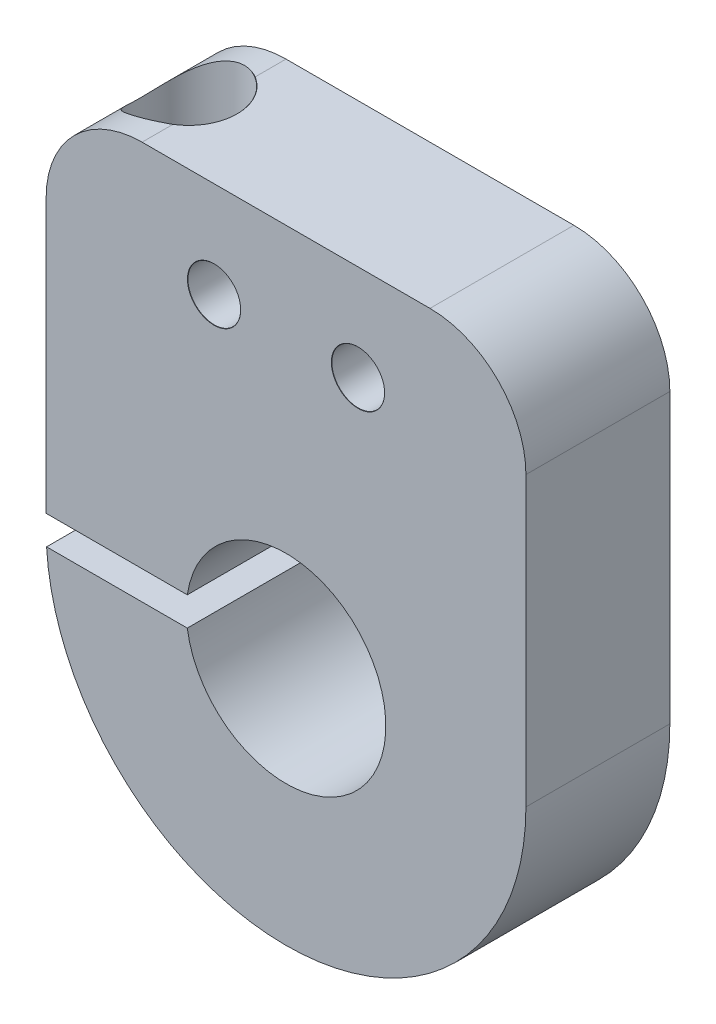
ISO-10303-21;
HEADER;
FILE_DESCRIPTION(('STEP AP214'),'2;1');
FILE_NAME('part.step','',(''),(''),'','','');
FILE_SCHEMA(('AUTOMOTIVE_DESIGN { 1 0 10303 214 1 1 1 1 }'));
ENDSEC;
DATA;
#1=APPLICATION_CONTEXT('core data for automotive mechanical design processes');
#2=APPLICATION_PROTOCOL_DEFINITION('international standard','automotive_design',2000,#1);
#3=PRODUCT_CONTEXT('',#1,'mechanical');
#4=PRODUCT('Part','Part','',(#3));
#5=PRODUCT_RELATED_PRODUCT_CATEGORY('part','',(#4));
#6=PRODUCT_DEFINITION_FORMATION('','',#4);
#7=PRODUCT_DEFINITION_CONTEXT('part definition',#1,'design');
#8=PRODUCT_DEFINITION('design','',#6,#7);
#9=PRODUCT_DEFINITION_SHAPE('','',#8);
#10=(LENGTH_UNIT() NAMED_UNIT(*) SI_UNIT(.MILLI.,.METRE.));
#11=(NAMED_UNIT(*) PLANE_ANGLE_UNIT() SI_UNIT($,.RADIAN.));
#12=(NAMED_UNIT(*) SI_UNIT($,.STERADIAN.) SOLID_ANGLE_UNIT());
#13=UNCERTAINTY_MEASURE_WITH_UNIT(LENGTH_MEASURE(1.E-05),#10,'distance_accuracy_value','');
#14=(GEOMETRIC_REPRESENTATION_CONTEXT(3) GLOBAL_UNCERTAINTY_ASSIGNED_CONTEXT((#13)) GLOBAL_UNIT_ASSIGNED_CONTEXT((#10,
#11,#12)) REPRESENTATION_CONTEXT('',''));
#15=CARTESIAN_POINT('',(0.,0.,0.));
#16=DIRECTION('',(0.,0.,1.));
#17=DIRECTION('',(1.,0.,0.));
#18=AXIS2_PLACEMENT_3D('',#15,#16,#17);
#19=CARTESIAN_POINT('',(-17.6231089266933,40.,7.5));
#20=DIRECTION('',(0.,1.,0.));
#21=DIRECTION('',(0.,0.,1.));
#22=AXIS2_PLACEMENT_3D('',#19,#20,#21);
#23=CYLINDRICAL_SURFACE('',#22,2.74999999999999);
#24=CARTESIAN_POINT('',(-17.6231089266933,-1.5,7.5));
#25=DIRECTION('',(0.,-1.,0.));
#26=DIRECTION('',(0.,0.,-1.));
#27=AXIS2_PLACEMENT_3D('',#24,#25,#26);
#28=CIRCLE('',#27,2.74999999999999);
#29=CARTESIAN_POINT('',(-17.6231089266933,-1.5,4.75000000000001));
#30=VERTEX_POINT('',#29);
#31=EDGE_CURVE('E232',#30,#30,#28,.T.);
#32=ORIENTED_EDGE('',*,*,#31,.F.);
#33=EDGE_LOOP('',(#32));
#34=FACE_BOUND('',#33,.T.);
#35=CARTESIAN_POINT('',(-17.6231089266933,-11.5,7.5));
#36=DIRECTION('',(0.,-1.,0.));
#37=DIRECTION('',(0.,0.,-1.));
#38=AXIS2_PLACEMENT_3D('',#35,#36,#37);
#39=CIRCLE('',#38,2.74999999999999);
#40=CARTESIAN_POINT('',(-17.6231089266933,-11.5,4.75000000000001));
#41=VERTEX_POINT('',#40);
#42=EDGE_CURVE('E194',#41,#41,#39,.F.);
#43=ORIENTED_EDGE('',*,*,#42,.F.);
#44=EDGE_LOOP('',(#43));
#45=FACE_BOUND('',#44,.T.);
#46=ADVANCED_FACE('F41',(#34,#45),#23,.F.);
#47=CARTESIAN_POINT('',(-25.,0.,15.));
#48=DIRECTION('',(-1.,0.,0.));
#49=DIRECTION('',(0.,0.,1.));
#50=AXIS2_PLACEMENT_3D('',#47,#48,#49);
#51=PLANE('',#50);
#52=DIRECTION('',(0.,1.,0.));
#53=VECTOR('',#52,1.);
#54=CARTESIAN_POINT('',(-25.,0.,15.));
#55=LINE('',#54,#53);
#56=CARTESIAN_POINT('',(-25.,1.5,15.));
#57=VERTEX_POINT('',#56);
#58=CARTESIAN_POINT('',(-25.,30.,15.));
#59=VERTEX_POINT('',#58);
#60=EDGE_CURVE('E260',#57,#59,#55,.T.);
#61=ORIENTED_EDGE('',*,*,#60,.T.);
#62=DIRECTION('',(0.,0.,-1.));
#63=VECTOR('',#62,1.);
#64=CARTESIAN_POINT('',(-25.,30.,15.));
#65=LINE('',#64,#63);
#66=CARTESIAN_POINT('',(-25.,30.,0.));
#67=VERTEX_POINT('',#66);
#68=EDGE_CURVE('E290',#59,#67,#65,.T.);
#69=ORIENTED_EDGE('',*,*,#68,.T.);
#70=DIRECTION('',(0.,1.,0.));
#71=VECTOR('',#70,1.);
#72=CARTESIAN_POINT('',(-25.,0.,0.));
#73=LINE('',#72,#71);
#74=CARTESIAN_POINT('',(-25.,1.5,0.));
#75=VERTEX_POINT('',#74);
#76=EDGE_CURVE('E275',#75,#67,#73,.T.);
#77=ORIENTED_EDGE('',*,*,#76,.F.);
#78=DIRECTION('',(0.,0.,1.));
#79=VECTOR('',#78,1.);
#80=CARTESIAN_POINT('',(-25.,1.5,0.));
#81=LINE('',#80,#79);
#82=EDGE_CURVE('E246',#75,#57,#81,.T.);
#83=ORIENTED_EDGE('',*,*,#82,.T.);
#84=EDGE_LOOP('',(#61,#69,#77,#83));
#85=FACE_BOUND('',#84,.T.);
#86=ADVANCED_FACE('F384',(#85),#51,.T.);
#87=CARTESIAN_POINT('',(0.,0.,15.));
#88=DIRECTION('',(0.,0.,-1.));
#89=DIRECTION('',(-1.,0.,0.));
#90=AXIS2_PLACEMENT_3D('',#87,#88,#89);
#91=CYLINDRICAL_SURFACE('',#90,25.);
#92=CARTESIAN_POINT('',(0.,0.,3.4));
#93=DIRECTION('',(0.,0.,-1.));
#94=DIRECTION('',(-1.,0.,0.));
#95=AXIS2_PLACEMENT_3D('',#92,#93,#94);
#96=CIRCLE('',#95,25.);
#97=CARTESIAN_POINT('',(-15.2559728230159,-19.8054359513594,3.4));
#98=VERTEX_POINT('',#97);
#99=CARTESIAN_POINT('',(-19.9902450303708,-15.0129978227447,3.4));
#100=VERTEX_POINT('',#99);
#101=EDGE_CURVE('E49',#98,#100,#96,.T.);
#102=ORIENTED_EDGE('',*,*,#101,.T.);
#103=CARTESIAN_POINT('',(0.,0.,-31.2241200483537));
#104=DIRECTION('',(-0.86602540378444,0.,-0.499999999999997));
#105=DIRECTION('',(0.499999999999997,0.,-0.86602540378444));
#106=AXIS2_PLACEMENT_3D('',#103,#104,#105);
#107=ELLIPSE('',#106,50.0000000000003,25.);
#108=CARTESIAN_POINT('',(-22.1979728804231,-11.5,7.22389680557545));
#109=VERTEX_POINT('',#108);
#110=EDGE_CURVE('E11',#100,#109,#107,.T.);
#111=ORIENTED_EDGE('',*,*,#110,.T.);
#112=DIRECTION('',(0.,0.,-1.));
#113=VECTOR('',#112,1.);
#114=CARTESIAN_POINT('',(-22.1979728804231,-11.5,15.));
#115=LINE('',#114,#113);
#116=CARTESIAN_POINT('',(-22.1979728804231,-11.5,7.77610319442457));
#117=VERTEX_POINT('',#116);
#118=EDGE_CURVE('E200',#117,#109,#115,.T.);
#119=ORIENTED_EDGE('',*,*,#118,.F.);
#120=CARTESIAN_POINT('',(0.,0.,46.2241200483529));
#121=DIRECTION('',(-0.866025403784435,0.,0.500000000000006));
#122=DIRECTION('',(-0.500000000000006,0.,-0.866025403784435));
#123=AXIS2_PLACEMENT_3D('',#120,#121,#122);
#124=ELLIPSE('',#123,49.9999999999994,25.);
#125=CARTESIAN_POINT('',(-19.9902450303708,-15.0129978227447,11.6));
#126=VERTEX_POINT('',#125);
#127=EDGE_CURVE('E174',#117,#126,#124,.T.);
#128=ORIENTED_EDGE('',*,*,#127,.T.);
#129=CARTESIAN_POINT('',(0.,0.,11.6));
#130=DIRECTION('',(0.,0.,1.));
#131=DIRECTION('',(1.,0.,0.));
#132=AXIS2_PLACEMENT_3D('',#129,#130,#131);
#133=CIRCLE('',#132,25.);
#134=CARTESIAN_POINT('',(-15.2559728230158,-19.8054359513595,11.6));
#135=VERTEX_POINT('',#134);
#136=EDGE_CURVE('E167',#126,#135,#133,.T.);
#137=ORIENTED_EDGE('',*,*,#136,.T.);
#138=CARTESIAN_POINT('',(0.,0.,-14.8241200483536));
#139=DIRECTION('',(0.86602540378444,0.,0.499999999999997));
#140=DIRECTION('',(0.499999999999997,0.,-0.86602540378444));
#141=AXIS2_PLACEMENT_3D('',#138,#139,#140);
#142=ELLIPSE('',#141,50.0000000000003,25.);
#143=CARTESIAN_POINT('',(-12.8888367193384,-21.4214352465523,7.49999999999999));
#144=VERTEX_POINT('',#143);
#145=EDGE_CURVE('E351',#135,#144,#142,.T.);
#146=ORIENTED_EDGE('',*,*,#145,.T.);
#147=CARTESIAN_POINT('',(0.,0.,29.8241200483531));
#148=DIRECTION('',(0.866025403784436,0.,-0.500000000000005));
#149=DIRECTION('',(-0.500000000000005,0.,-0.866025403784436));
#150=AXIS2_PLACEMENT_3D('',#147,#148,#149);
#151=ELLIPSE('',#150,49.9999999999995,25.);
#152=EDGE_CURVE('E354',#144,#98,#151,.T.);
#153=ORIENTED_EDGE('',*,*,#152,.T.);
#154=EDGE_LOOP('',(#102,#111,#119,#128,#137,#146,#153));
#155=FACE_BOUND('',#154,.T.);
#156=CARTESIAN_POINT('',(0.,0.,15.));
#157=DIRECTION('',(0.,0.,1.));
#158=DIRECTION('',(1.,0.,0.));
#159=AXIS2_PLACEMENT_3D('',#156,#157,#158);
#160=CIRCLE('',#159,25.);
#161=CARTESIAN_POINT('',(-24.9549594269356,-1.5,15.));
#162=VERTEX_POINT('',#161);
#163=CARTESIAN_POINT('',(25.,0.,15.));
#164=VERTEX_POINT('',#163);
#165=EDGE_CURVE('E264',#162,#164,#160,.T.);
#166=ORIENTED_EDGE('',*,*,#165,.F.);
#167=DIRECTION('',(0.,0.,-1.));
#168=VECTOR('',#167,1.);
#169=CARTESIAN_POINT('',(-24.9549594269356,-1.5,15.));
#170=LINE('',#169,#168);
#171=CARTESIAN_POINT('',(-24.9549594269356,-1.5,0.));
#172=VERTEX_POINT('',#171);
#173=EDGE_CURVE('E249',#162,#172,#170,.T.);
#174=ORIENTED_EDGE('',*,*,#173,.T.);
#175=CARTESIAN_POINT('',(0.,0.,0.));
#176=DIRECTION('',(0.,0.,1.));
#177=DIRECTION('',(1.,0.,0.));
#178=AXIS2_PLACEMENT_3D('',#175,#176,#177);
#179=CIRCLE('',#178,25.);
#180=CARTESIAN_POINT('',(25.,0.,0.));
#181=VERTEX_POINT('',#180);
#182=EDGE_CURVE('E278',#172,#181,#179,.T.);
#183=ORIENTED_EDGE('',*,*,#182,.T.);
#184=DIRECTION('',(0.,0.,-1.));
#185=VECTOR('',#184,1.);
#186=CARTESIAN_POINT('',(25.,0.,15.));
#187=LINE('',#186,#185);
#188=EDGE_CURVE('E272',#164,#181,#187,.T.);
#189=ORIENTED_EDGE('',*,*,#188,.F.);
#190=EDGE_LOOP('',(#166,#174,#183,#189));
#191=FACE_BOUND('',#190,.T.);
#192=ADVANCED_FACE('F358',(#155,#191),#91,.T.);
#193=CARTESIAN_POINT('',(25.,0.,15.));
#194=DIRECTION('',(1.,0.,0.));
#195=DIRECTION('',(0.,0.,-1.));
#196=AXIS2_PLACEMENT_3D('',#193,#194,#195);
#197=PLANE('',#196);
#198=DIRECTION('',(0.,-1.,0.));
#199=VECTOR('',#198,1.);
#200=CARTESIAN_POINT('',(25.,0.,0.));
#201=LINE('',#200,#199);
#202=CARTESIAN_POINT('',(25.,30.,0.));
#203=VERTEX_POINT('',#202);
#204=EDGE_CURVE('E281',#203,#181,#201,.T.);
#205=ORIENTED_EDGE('',*,*,#204,.F.);
#206=DIRECTION('',(0.,0.,-1.));
#207=VECTOR('',#206,1.);
#208=CARTESIAN_POINT('',(25.,30.,15.));
#209=LINE('',#208,#207);
#210=CARTESIAN_POINT('',(25.,30.,15.));
#211=VERTEX_POINT('',#210);
#212=EDGE_CURVE('E64',#203,#211,#209,.F.);
#213=ORIENTED_EDGE('',*,*,#212,.T.);
#214=DIRECTION('',(0.,-1.,0.));
#215=VECTOR('',#214,1.);
#216=CARTESIAN_POINT('',(25.,0.,15.));
#217=LINE('',#216,#215);
#218=EDGE_CURVE('E267',#211,#164,#217,.T.);
#219=ORIENTED_EDGE('',*,*,#218,.T.);
#220=ORIENTED_EDGE('',*,*,#188,.T.);
#221=EDGE_LOOP('',(#205,#213,#219,#220));
#222=FACE_BOUND('',#221,.T.);
#223=ADVANCED_FACE('F435',(#222),#197,.T.);
#224=CARTESIAN_POINT('',(0.,0.,15.));
#225=DIRECTION('',(0.,0.,-1.));
#226=DIRECTION('',(-1.,0.,0.));
#227=AXIS2_PLACEMENT_3D('',#224,#225,#226);
#228=CYLINDRICAL_SURFACE('',#227,10.4);
#229=DIRECTION('',(0.,0.,1.));
#230=VECTOR('',#229,1.);
#231=CARTESIAN_POINT('',(-10.2912584264511,1.5,0.));
#232=LINE('',#231,#230);
#233=CARTESIAN_POINT('',(-10.2912584264511,1.5,0.));
#234=VERTEX_POINT('',#233);
#235=CARTESIAN_POINT('',(-10.2912584264511,1.5,15.));
#236=VERTEX_POINT('',#235);
#237=EDGE_CURVE('E250',#234,#236,#232,.T.);
#238=ORIENTED_EDGE('',*,*,#237,.F.);
#239=CARTESIAN_POINT('',(0.,0.,0.));
#240=DIRECTION('',(0.,0.,1.));
#241=DIRECTION('',(1.,0.,0.));
#242=AXIS2_PLACEMENT_3D('',#239,#240,#241);
#243=CIRCLE('',#242,10.4);
#244=CARTESIAN_POINT('',(-10.2912584264511,-1.5,0.));
#245=VERTEX_POINT('',#244);
#246=EDGE_CURVE('E256',#245,#234,#243,.T.);
#247=ORIENTED_EDGE('',*,*,#246,.F.);
#248=DIRECTION('',(0.,0.,1.));
#249=VECTOR('',#248,1.);
#250=CARTESIAN_POINT('',(-10.2912584264511,-1.5,0.));
#251=LINE('',#250,#249);
#252=CARTESIAN_POINT('',(-10.2912584264511,-1.5,15.));
#253=VERTEX_POINT('',#252);
#254=EDGE_CURVE('E242',#245,#253,#251,.T.);
#255=ORIENTED_EDGE('',*,*,#254,.T.);
#256=CARTESIAN_POINT('',(0.,0.,15.));
#257=DIRECTION('',(0.,0.,1.));
#258=DIRECTION('',(1.,0.,0.));
#259=AXIS2_PLACEMENT_3D('',#256,#257,#258);
#260=CIRCLE('',#259,10.4);
#261=EDGE_CURVE('E257',#253,#236,#260,.T.);
#262=ORIENTED_EDGE('',*,*,#261,.T.);
#263=EDGE_LOOP('',(#238,#247,#255,#262));
#264=FACE_BOUND('',#263,.T.);
#265=ADVANCED_FACE('F429',(#264),#228,.F.);
#266=CARTESIAN_POINT('',(0.,40.,15.));
#267=DIRECTION('',(0.,1.,0.));
#268=DIRECTION('',(0.,0.,1.));
#269=AXIS2_PLACEMENT_3D('',#266,#267,#268);
#270=PLANE('',#269);
#271=DIRECTION('',(1.,0.,0.));
#272=VECTOR('',#271,1.);
#273=CARTESIAN_POINT('',(0.,40.,0.));
#274=LINE('',#273,#272);
#275=CARTESIAN_POINT('',(-15.,40.,0.));
#276=VERTEX_POINT('',#275);
#277=CARTESIAN_POINT('',(15.,40.,0.));
#278=VERTEX_POINT('',#277);
#279=EDGE_CURVE('E261',#276,#278,#274,.T.);
#280=ORIENTED_EDGE('',*,*,#279,.F.);
#281=DIRECTION('',(0.,0.,-1.));
#282=VECTOR('',#281,1.);
#283=CARTESIAN_POINT('',(-15.,40.,15.));
#284=LINE('',#283,#282);
#285=CARTESIAN_POINT('',(-15.,40.,3.21398500251085));
#286=VERTEX_POINT('',#285);
#287=EDGE_CURVE('E302',#276,#286,#284,.F.);
#288=ORIENTED_EDGE('',*,*,#287,.T.);
#289=CARTESIAN_POINT('',(-17.6231089266933,40.,7.5));
#290=DIRECTION('',(0.,1.,0.));
#291=DIRECTION('',(0.,0.,1.));
#292=AXIS2_PLACEMENT_3D('',#289,#290,#291);
#293=CIRCLE('',#292,5.025);
#294=CARTESIAN_POINT('',(-15.,40.,11.7860149974891));
#295=VERTEX_POINT('',#294);
#296=EDGE_CURVE('E220',#295,#286,#293,.T.);
#297=ORIENTED_EDGE('',*,*,#296,.F.);
#298=DIRECTION('',(0.,0.,-1.));
#299=VECTOR('',#298,1.);
#300=CARTESIAN_POINT('',(-15.,40.,15.));
#301=LINE('',#300,#299);
#302=CARTESIAN_POINT('',(-15.,40.,15.));
#303=VERTEX_POINT('',#302);
#304=EDGE_CURVE('E300',#295,#303,#301,.F.);
#305=ORIENTED_EDGE('',*,*,#304,.T.);
#306=DIRECTION('',(1.,0.,0.));
#307=VECTOR('',#306,1.);
#308=CARTESIAN_POINT('',(0.,40.,15.));
#309=LINE('',#308,#307);
#310=CARTESIAN_POINT('',(15.,40.,15.));
#311=VERTEX_POINT('',#310);
#312=EDGE_CURVE('E269',#303,#311,#309,.T.);
#313=ORIENTED_EDGE('',*,*,#312,.T.);
#314=DIRECTION('',(0.,0.,-1.));
#315=VECTOR('',#314,1.);
#316=CARTESIAN_POINT('',(15.,40.,15.));
#317=LINE('',#316,#315);
#318=EDGE_CURVE('E297',#311,#278,#317,.T.);
#319=ORIENTED_EDGE('',*,*,#318,.T.);
#320=EDGE_LOOP('',(#280,#288,#297,#305,#313,#319));
#321=FACE_BOUND('',#320,.T.);
#322=ADVANCED_FACE('F439',(#321),#270,.T.);
#323=CARTESIAN_POINT('',(0.,0.,15.));
#324=DIRECTION('',(0.,0.,1.));
#325=DIRECTION('',(1.,0.,0.));
#326=AXIS2_PLACEMENT_3D('',#323,#324,#325);
#327=PLANE('',#326);
#328=CARTESIAN_POINT('',(-7.5,30.,15.));
#329=DIRECTION('',(0.,0.,1.));
#330=DIRECTION('',(1.,0.,0.));
#331=AXIS2_PLACEMENT_3D('',#328,#329,#330);
#332=CIRCLE('',#331,2.775);
#333=CARTESIAN_POINT('',(-4.725,30.,15.));
#334=VERTEX_POINT('',#333);
#335=EDGE_CURVE('E202',#334,#334,#332,.T.);
#336=ORIENTED_EDGE('',*,*,#335,.F.);
#337=EDGE_LOOP('',(#336));
#338=FACE_BOUND('',#337,.T.);
#339=CARTESIAN_POINT('',(7.5,30.,15.));
#340=DIRECTION('',(0.,0.,1.));
#341=DIRECTION('',(1.,0.,0.));
#342=AXIS2_PLACEMENT_3D('',#339,#340,#341);
#343=CIRCLE('',#342,2.775);
#344=CARTESIAN_POINT('',(10.275,30.,15.));
#345=VERTEX_POINT('',#344);
#346=EDGE_CURVE('E211',#345,#345,#343,.T.);
#347=ORIENTED_EDGE('',*,*,#346,.F.);
#348=EDGE_LOOP('',(#347));
#349=FACE_BOUND('',#348,.T.);
#350=ORIENTED_EDGE('',*,*,#312,.F.);
#351=CARTESIAN_POINT('',(-15.,30.,15.));
#352=DIRECTION('',(0.,0.,1.));
#353=DIRECTION('',(1.,0.,0.));
#354=AXIS2_PLACEMENT_3D('',#351,#352,#353);
#355=CIRCLE('',#354,10.);
#356=EDGE_CURVE('E344',#303,#59,#355,.T.);
#357=ORIENTED_EDGE('',*,*,#356,.T.);
#358=ORIENTED_EDGE('',*,*,#60,.F.);
#359=DIRECTION('',(-1.,0.,0.));
#360=VECTOR('',#359,1.);
#361=CARTESIAN_POINT('',(-25.,1.5,15.));
#362=LINE('',#361,#360);
#363=EDGE_CURVE('E243',#236,#57,#362,.T.);
#364=ORIENTED_EDGE('',*,*,#363,.F.);
#365=ORIENTED_EDGE('',*,*,#261,.F.);
#366=DIRECTION('',(1.,0.,0.));
#367=VECTOR('',#366,1.);
#368=CARTESIAN_POINT('',(-25.,-1.5,15.));
#369=LINE('',#368,#367);
#370=EDGE_CURVE('E238',#162,#253,#369,.T.);
#371=ORIENTED_EDGE('',*,*,#370,.F.);
#372=ORIENTED_EDGE('',*,*,#165,.T.);
#373=ORIENTED_EDGE('',*,*,#218,.F.);
#374=CARTESIAN_POINT('',(15.,30.,15.));
#375=DIRECTION('',(0.,0.,1.));
#376=DIRECTION('',(1.,0.,0.));
#377=AXIS2_PLACEMENT_3D('',#374,#375,#376);
#378=CIRCLE('',#377,10.);
#379=EDGE_CURVE('E342',#211,#311,#378,.T.);
#380=ORIENTED_EDGE('',*,*,#379,.T.);
#381=EDGE_LOOP('',(#350,#357,#358,#364,#365,#371,#372,#373,#380));
#382=FACE_BOUND('',#381,.T.);
#383=ADVANCED_FACE('F417',(#338,#349,#382),#327,.T.);
#384=CARTESIAN_POINT('',(0.,0.,0.));
#385=DIRECTION('',(0.,0.,1.));
#386=DIRECTION('',(1.,0.,0.));
#387=AXIS2_PLACEMENT_3D('',#384,#385,#386);
#388=PLANE('',#387);
#389=CARTESIAN_POINT('',(-7.5,30.,0.));
#390=DIRECTION('',(0.,0.,1.));
#391=DIRECTION('',(1.,0.,0.));
#392=AXIS2_PLACEMENT_3D('',#389,#390,#391);
#393=CIRCLE('',#392,2.75);
#394=CARTESIAN_POINT('',(-4.75,30.,0.));
#395=VERTEX_POINT('',#394);
#396=EDGE_CURVE('E208',#395,#395,#393,.T.);
#397=ORIENTED_EDGE('',*,*,#396,.T.);
#398=EDGE_LOOP('',(#397));
#399=FACE_BOUND('',#398,.T.);
#400=CARTESIAN_POINT('',(7.5,30.,0.));
#401=DIRECTION('',(0.,0.,1.));
#402=DIRECTION('',(1.,0.,0.));
#403=AXIS2_PLACEMENT_3D('',#400,#401,#402);
#404=CIRCLE('',#403,2.75);
#405=CARTESIAN_POINT('',(10.25,30.,0.));
#406=VERTEX_POINT('',#405);
#407=EDGE_CURVE('E217',#406,#406,#404,.T.);
#408=ORIENTED_EDGE('',*,*,#407,.T.);
#409=EDGE_LOOP('',(#408));
#410=FACE_BOUND('',#409,.T.);
#411=ORIENTED_EDGE('',*,*,#76,.T.);
#412=CARTESIAN_POINT('',(-15.,30.,0.));
#413=DIRECTION('',(0.,0.,1.));
#414=DIRECTION('',(1.,0.,0.));
#415=AXIS2_PLACEMENT_3D('',#412,#413,#414);
#416=CIRCLE('',#415,10.);
#417=EDGE_CURVE('E295',#67,#276,#416,.F.);
#418=ORIENTED_EDGE('',*,*,#417,.T.);
#419=ORIENTED_EDGE('',*,*,#279,.T.);
#420=CARTESIAN_POINT('',(15.,30.,0.));
#421=DIRECTION('',(0.,0.,1.));
#422=DIRECTION('',(1.,0.,0.));
#423=AXIS2_PLACEMENT_3D('',#420,#421,#422);
#424=CIRCLE('',#423,10.);
#425=EDGE_CURVE('E293',#278,#203,#424,.F.);
#426=ORIENTED_EDGE('',*,*,#425,.T.);
#427=ORIENTED_EDGE('',*,*,#204,.T.);
#428=ORIENTED_EDGE('',*,*,#182,.F.);
#429=DIRECTION('',(1.,0.,0.));
#430=VECTOR('',#429,1.);
#431=CARTESIAN_POINT('',(0.,-1.5,0.));
#432=LINE('',#431,#430);
#433=EDGE_CURVE('E287',#172,#245,#432,.T.);
#434=ORIENTED_EDGE('',*,*,#433,.T.);
#435=ORIENTED_EDGE('',*,*,#246,.T.);
#436=DIRECTION('',(-1.,0.,0.));
#437=VECTOR('',#436,1.);
#438=CARTESIAN_POINT('',(-25.,1.5,0.));
#439=LINE('',#438,#437);
#440=EDGE_CURVE('E239',#234,#75,#439,.T.);
#441=ORIENTED_EDGE('',*,*,#440,.T.);
#442=EDGE_LOOP('',(#411,#418,#419,#426,#427,#428,#434,#435,#441));
#443=FACE_BOUND('',#442,.T.);
#444=ADVANCED_FACE('F425',(#399,#410,#443),#388,.F.);
#445=CARTESIAN_POINT('',(-25.,-1.5,0.));
#446=DIRECTION('',(0.,-1.,0.));
#447=DIRECTION('',(0.,0.,-1.));
#448=AXIS2_PLACEMENT_3D('',#445,#446,#447);
#449=PLANE('',#448);
#450=ORIENTED_EDGE('',*,*,#31,.T.);
#451=EDGE_LOOP('',(#450));
#452=FACE_BOUND('',#451,.T.);
#453=ORIENTED_EDGE('',*,*,#370,.T.);
#454=ORIENTED_EDGE('',*,*,#254,.F.);
#455=ORIENTED_EDGE('',*,*,#433,.F.);
#456=ORIENTED_EDGE('',*,*,#173,.F.);
#457=EDGE_LOOP('',(#453,#454,#455,#456));
#458=FACE_BOUND('',#457,.T.);
#459=ADVANCED_FACE('F403',(#452,#458),#449,.F.);
#460=CARTESIAN_POINT('',(-25.,1.5,0.));
#461=DIRECTION('',(0.,1.,0.));
#462=DIRECTION('',(0.,0.,1.));
#463=AXIS2_PLACEMENT_3D('',#460,#461,#462);
#464=PLANE('',#463);
#465=CARTESIAN_POINT('',(-17.6231089266933,1.5,7.5));
#466=DIRECTION('',(0.,1.,0.));
#467=DIRECTION('',(0.,0.,1.));
#468=AXIS2_PLACEMENT_3D('',#465,#466,#467);
#469=CIRCLE('',#468,2.74999999999999);
#470=CARTESIAN_POINT('',(-17.6231089266933,1.5,10.25));
#471=VERTEX_POINT('',#470);
#472=EDGE_CURVE('E235',#471,#471,#469,.T.);
#473=ORIENTED_EDGE('',*,*,#472,.T.);
#474=EDGE_LOOP('',(#473));
#475=FACE_BOUND('',#474,.T.);
#476=ORIENTED_EDGE('',*,*,#363,.T.);
#477=ORIENTED_EDGE('',*,*,#82,.F.);
#478=ORIENTED_EDGE('',*,*,#440,.F.);
#479=ORIENTED_EDGE('',*,*,#237,.T.);
#480=EDGE_LOOP('',(#476,#477,#478,#479));
#481=FACE_BOUND('',#480,.T.);
#482=ADVANCED_FACE('F396',(#475,#481),#464,.F.);
#483=CARTESIAN_POINT('',(-17.6231089266933,30.,7.5));
#484=DIRECTION('',(0.,1.,0.));
#485=DIRECTION('',(0.,0.,1.));
#486=AXIS2_PLACEMENT_3D('',#483,#484,#485);
#487=CIRCLE('',#486,2.75);
#488=CARTESIAN_POINT('',(-17.6231089266933,30.,10.25));
#489=VERTEX_POINT('',#488);
#490=EDGE_CURVE('E229',#489,#489,#487,.T.);
#491=ORIENTED_EDGE('',*,*,#490,.T.);
#492=EDGE_LOOP('',(#491));
#493=FACE_BOUND('',#492,.T.);
#494=ORIENTED_EDGE('',*,*,#472,.F.);
#495=EDGE_LOOP('',(#494));
#496=FACE_BOUND('',#495,.T.);
#497=ADVANCED_FACE('F386',(#493,#496),#23,.F.);
#498=CARTESIAN_POINT('',(-12.6231089266933,30.,7.5));
#499=DIRECTION('',(0.,-1.,0.));
#500=DIRECTION('',(0.,0.,-1.));
#501=AXIS2_PLACEMENT_3D('',#498,#499,#500);
#502=PLANE('',#501);
#503=ORIENTED_EDGE('',*,*,#490,.F.);
#504=EDGE_LOOP('',(#503));
#505=FACE_BOUND('',#504,.T.);
#506=CARTESIAN_POINT('',(-17.6231089266933,30.,7.5));
#507=DIRECTION('',(0.,1.,0.));
#508=DIRECTION('',(0.,0.,1.));
#509=AXIS2_PLACEMENT_3D('',#506,#507,#508);
#510=CIRCLE('',#509,5.);
#511=CARTESIAN_POINT('',(-17.6231089266933,30.,12.5));
#512=VERTEX_POINT('',#511);
#513=EDGE_CURVE('E226',#512,#512,#510,.T.);
#514=ORIENTED_EDGE('',*,*,#513,.T.);
#515=EDGE_LOOP('',(#514));
#516=FACE_BOUND('',#515,.T.);
#517=ADVANCED_FACE('F333',(#505,#516),#502,.F.);
#518=CARTESIAN_POINT('',(-17.6231089266933,40.,7.5));
#519=DIRECTION('',(0.,1.,0.));
#520=DIRECTION('',(0.,0.,1.));
#521=AXIS2_PLACEMENT_3D('',#518,#519,#520);
#522=CYLINDRICAL_SURFACE('',#521,5.);
#523=ORIENTED_EDGE('',*,*,#513,.F.);
#524=EDGE_LOOP('',(#523));
#525=FACE_BOUND('',#524,.T.);
#526=CARTESIAN_POINT('',(-17.6231089266933,39.975,7.5));
#527=DIRECTION('',(0.,1.,0.));
#528=DIRECTION('',(0.,0.,1.));
#529=AXIS2_PLACEMENT_3D('',#526,#527,#528);
#530=CIRCLE('',#529,4.99999999999999);
#531=CARTESIAN_POINT('',(-15.7066647012552,39.975,12.1181426494625));
#532=VERTEX_POINT('',#531);
#533=CARTESIAN_POINT('',(-15.7066647012552,39.975,2.88185735053748));
#534=VERTEX_POINT('',#533);
#535=EDGE_CURVE('E223',#532,#534,#530,.T.);
#536=ORIENTED_EDGE('',*,*,#535,.T.);
#537=CARTESIAN_POINT('',(-15.7066647012561,39.9749999999999,2.88185735053709));
#538=CARTESIAN_POINT('',(-15.8271688993205,39.9664840688341,2.83182532931298));
#539=CARTESIAN_POINT('',(-15.9495061936912,39.9556025788782,2.78661106016261));
#540=CARTESIAN_POINT('',(-16.1968200310193,39.9288960013164,2.70598803773824));
#541=CARTESIAN_POINT('',(-16.3217961225632,39.9130717529708,2.67057762173363));
#542=CARTESIAN_POINT('',(-16.5728701441365,39.8763422669605,2.60984392591017));
#543=CARTESIAN_POINT('',(-16.6989610942999,39.8554588009646,2.58447861871605));
#544=CARTESIAN_POINT('',(-16.9517733439806,39.8085219267968,2.5436202131838));
#545=CARTESIAN_POINT('',(-17.0784946357625,39.7824685819171,2.52812699399618));
#546=CARTESIAN_POINT('',(-17.3315501362063,39.7252607864639,2.50689359916728));
#547=CARTESIAN_POINT('',(-17.457884465663,39.6941081388811,2.50114998443225));
#548=CARTESIAN_POINT('',(-17.7093474835209,39.6268575199258,2.49916195885715));
#549=CARTESIAN_POINT('',(-17.8344756970329,39.5907576794906,2.50292114761129));
#550=CARTESIAN_POINT('',(-18.082698805686,39.5138764677824,2.51961338395149));
#551=CARTESIAN_POINT('',(-18.205793162393,39.4730938788353,2.53254882222379));
#552=CARTESIAN_POINT('',(-18.449225217401,39.387201198245,2.56718445953983));
#553=CARTESIAN_POINT('',(-18.5695618266114,39.3420894322003,2.58888806035914));
#554=CARTESIAN_POINT('',(-18.9359760800402,39.1966795042922,2.6687900722557));
#555=CARTESIAN_POINT('',(-19.1765070727565,39.0897093836663,2.74101080185084));
#556=CARTESIAN_POINT('',(-19.6386376671248,38.8628175502327,2.91753529959067));
#557=CARTESIAN_POINT('',(-19.86023361681,38.7428933490485,3.02184523895605));
#558=CARTESIAN_POINT('',(-20.3153759556519,38.4750743438561,3.27743463577578));
#559=CARTESIAN_POINT('',(-20.5453792190121,38.3257370239529,3.43350653246944));
#560=CARTESIAN_POINT('',(-20.9755653450086,38.0225912235692,3.78010755722986));
#561=CARTESIAN_POINT('',(-21.1756747975792,37.8687728098567,3.97071904632327));
#562=CARTESIAN_POINT('',(-21.4651092175859,37.6302816540147,4.29620853357233));
#563=CARTESIAN_POINT('',(-21.5653774785529,37.5440006149514,4.42035241235295));
#564=CARTESIAN_POINT('',(-21.7546684043923,37.3749932408077,4.67936785149592));
#565=CARTESIAN_POINT('',(-21.8436864032259,37.2922683899789,4.81424382544093));
#566=CARTESIAN_POINT('',(-22.0093267700636,37.1331961127943,5.09428539888836));
#567=CARTESIAN_POINT('',(-22.0859872125924,37.0568294621497,5.23941733098584));
#568=CARTESIAN_POINT('',(-22.2259889566545,36.913400963776,5.54015305313856));
#569=CARTESIAN_POINT('',(-22.2893441341096,36.8463294473346,5.6957457079295));
#570=CARTESIAN_POINT('',(-22.4074715797942,36.7184668831732,6.03522738845709));
#571=CARTESIAN_POINT('',(-22.4605026296813,36.6592067564557,6.22033805448552));
#572=CARTESIAN_POINT('',(-22.5241821948302,36.5869346457856,6.50552213727889));
#573=CARTESIAN_POINT('',(-22.5427601839796,36.5656185469739,6.60179867449453));
#574=CARTESIAN_POINT('',(-22.5743353914182,36.5291674905896,6.79639827524133));
#575=CARTESIAN_POINT('',(-22.5873352479911,36.5140296110769,6.89472034817458));
#576=CARTESIAN_POINT('',(-22.6075717827999,36.4903850384701,7.09355622476605));
#577=CARTESIAN_POINT('',(-22.6147616943063,36.4819321672138,7.19408125189371));
#578=CARTESIAN_POINT('',(-22.6230399132317,36.4721946724505,7.39573088404251));
#579=CARTESIAN_POINT('',(-22.6241283382175,36.4709099108245,7.4968554774733));
#580=CARTESIAN_POINT('',(-22.6201743232093,36.4755659172757,7.69884881459907));
#581=CARTESIAN_POINT('',(-22.6151301246536,36.4815087579057,7.79971747659124));
#582=CARTESIAN_POINT('',(-22.5990357471018,36.5003692585707,8.00029021282858));
#583=CARTESIAN_POINT('',(-22.5879855730026,36.513286912919,8.09999428802318));
#584=CARTESIAN_POINT('',(-22.5486293309289,36.5589446601567,8.37875638116313));
#585=CARTESIAN_POINT('',(-22.5136051903876,36.5992507838923,8.55568918530009));
#586=CARTESIAN_POINT('',(-22.4263659242412,36.697262406354,8.900150368575));
#587=CARTESIAN_POINT('',(-22.374136239897,36.754982636805,9.06767064214575));
#588=CARTESIAN_POINT('',(-22.2664354657795,36.8705066672736,9.35976105577596));
#589=CARTESIAN_POINT('',(-22.213658523603,36.926026514265,9.48626322234209));
#590=CARTESIAN_POINT('',(-22.0992346922777,37.0432643693166,9.73219596008421));
#591=CARTESIAN_POINT('',(-22.0375857483523,37.1049838122151,9.85162488401081));
#592=CARTESIAN_POINT('',(-21.9059797364165,37.2329721650723,10.0835695645842));
#593=CARTESIAN_POINT('',(-21.8360074818639,37.29924929502,10.1960720980856));
#594=CARTESIAN_POINT('',(-21.6883546538083,37.4347803243799,10.4139481552069));
#595=CARTESIAN_POINT('',(-21.6106751124021,37.5040338245189,10.5193226301882));
#596=CARTESIAN_POINT('',(-21.445145582253,37.6467271800104,10.7264858300389));
#597=CARTESIAN_POINT('',(-21.3570372869553,37.720229049848,10.8280256857477));
#598=CARTESIAN_POINT('',(-21.1732440532679,37.8679732058306,11.0234281109442));
#599=CARTESIAN_POINT('',(-21.0775565116411,37.9422157386506,11.1172880199068));
#600=CARTESIAN_POINT('',(-20.7794138785682,38.1645340959821,11.3871030841649));
#601=CARTESIAN_POINT('',(-20.5657925614669,38.3122767622292,11.5514012378899));
#602=CARTESIAN_POINT('',(-20.2030878937828,38.5412927715378,11.7859930387624));
#603=CARTESIAN_POINT('',(-20.0627723306104,38.625318133475,11.8674574825322));
#604=CARTESIAN_POINT('',(-19.7727955716529,38.7890898099491,12.0172409436048));
#605=CARTESIAN_POINT('',(-19.6231325562171,38.8688352856757,12.0855573907815));
#606=CARTESIAN_POINT('',(-19.3154882560655,39.0225329680401,12.207782182984));
#607=CARTESIAN_POINT('',(-19.1575193826427,39.0964934295791,12.2617113331638));
#608=CARTESIAN_POINT('',(-18.8341309535763,39.2374511797875,12.3540361940868));
#609=CARTESIAN_POINT('',(-18.6687146442799,39.3044514610822,12.3924386014794));
#610=CARTESIAN_POINT('',(-18.3769026882967,39.4134961984182,12.4444431744089));
#611=CARTESIAN_POINT('',(-18.2518903932597,39.4574253895027,12.4619301609269));
#612=CARTESIAN_POINT('',(-17.9993513210928,39.5405212636155,12.4874380121234));
#613=CARTESIAN_POINT('',(-17.8718250836497,39.5796889561649,12.4954608865104));
#614=CARTESIAN_POINT('',(-17.6151648868238,39.6529120398095,12.5016401330362));
#615=CARTESIAN_POINT('',(-17.4860320796998,39.6869708892712,12.4998032109063));
#616=CARTESIAN_POINT('',(-17.2270709115528,39.7497639239333,12.4859761051406));
#617=CARTESIAN_POINT('',(-17.0972428854271,39.7785004705861,12.4739904376174));
#618=CARTESIAN_POINT('',(-16.837728144424,39.8305791357678,12.4396684117463));
#619=CARTESIAN_POINT('',(-16.7080417111119,39.8539156905235,12.4173214484038));
#620=CARTESIAN_POINT('',(-16.4500168130512,39.895177107867,12.3622281637464));
#621=CARTESIAN_POINT('',(-16.3216783945433,39.9131017853934,12.3294814868875));
#622=CARTESIAN_POINT('',(-16.0668687290498,39.9437570477598,12.2535096015351));
#623=CARTESIAN_POINT('',(-15.9404085466571,39.9564637838337,12.2102376891091));
#624=CARTESIAN_POINT('',(-15.690995849391,39.9768881604327,12.1135557278158));
#625=CARTESIAN_POINT('',(-15.5680436493169,39.984605354544,12.0601447723624));
#626=CARTESIAN_POINT('',(-15.447378730266,39.9899876011788,12.0017994304894));
#627=B_SPLINE_CURVE_WITH_KNOTS('',3,(#537,#538,#539,#540,#541,#542,#543,#544,#545,#546,#547,
#548,#549,#550,#551,#552,#553,#554,#555,#556,#557,#558,#559,#560,#561,#562,#563,#564,#565,#566,
#567,#568,#569,#570,#571,#572,#573,#574,#575,#576,#577,#578,#579,#580,#581,#582,#583,#584,#585,
#586,#587,#588,#589,#590,#591,#592,#593,#594,#595,#596,#597,#598,#599,#600,#601,#602,#603,#604,
#605,#606,#607,#608,#609,#610,#611,#612,#613,#614,#615,#616,#617,#618,#619,#620,#621,#622,#623,
#624,#625,#626),.UNSPECIFIED.,.F.,.F.,(4,2,2,2,2,2,2,2,2,2,2,2,2,2,2,2,2,2,2,2,2,2,2,2,2,2,2,2,
2,2,2,2,2,2,2,2,2,2,2,2,2,2,2,2,4),(0.,0.39214577050247,0.784224992399733,1.17464602426711,
1.56506227669047,1.95534078431313,2.34576714880278,2.73629526836039,3.12697504646132,
3.94244203214239,4.75806594210045,5.70113570845139,6.64648458490208,7.19013444230658,
7.73400904329393,8.27617450296038,8.81777170489213,9.41967532088728,9.72039970858256,
10.0209817057734,10.3239597661746,10.6269319886137,10.9299911104099,11.2330499851167,
11.7851720168121,12.3377624403858,12.7808306001319,13.2240015411519,13.6679938571041,
14.1119267972726,14.5711647412748,15.0305611090699,15.9488851660401,16.4964213175325,
17.044064391085,17.5909111838149,18.1375218705035,18.5380822074319,18.9385574698775,
19.338760400227,19.7387853369252,20.1392206140942,20.5396695827684,20.9419289739531,
21.3442243502675),.UNSPECIFIED.);
#628=EDGE_CURVE('E336',#534,#532,#627,.T.);
#629=ORIENTED_EDGE('',*,*,#628,.T.);
#630=EDGE_LOOP('',(#536,#629));
#631=FACE_BOUND('',#630,.T.);
#632=ADVANCED_FACE('F326',(#525,#631),#522,.F.);
#633=CARTESIAN_POINT('',(-17.6231089266933,40.,7.5));
#634=DIRECTION('',(0.,1.,0.));
#635=DIRECTION('',(0.,0.,1.));
#636=AXIS2_PLACEMENT_3D('',#633,#634,#635);
#637=CONICAL_SURFACE('',#636,5.025,0.785398163397518);
#638=ORIENTED_EDGE('',*,*,#296,.T.);
#639=CARTESIAN_POINT('',(-15.,40.,3.21398500251085));
#640=CARTESIAN_POINT('',(-15.078365632951,40.0000047129785,3.16600824776666));
#641=CARTESIAN_POINT('',(-15.1585615857086,39.9990786662512,3.12097826127056));
#642=CARTESIAN_POINT('',(-15.3215916183365,39.9951568419718,3.03756849935948));
#643=CARTESIAN_POINT('',(-15.4044037640574,39.9921753412154,2.99914512161279));
#644=CARTESIAN_POINT('',(-15.5727470912723,39.9839398017062,2.92902750875078));
#645=CARTESIAN_POINT('',(-15.6582786869526,39.9786854152301,2.89733430437516));
#646=CARTESIAN_POINT('',(-15.8320630658653,39.9657093488475,2.84084502170242));
#647=CARTESIAN_POINT('',(-15.9203305904496,39.9579708367045,2.81609822037715));
#648=CARTESIAN_POINT('',(-16.0093748425582,39.9489277023813,2.79512815326316));
#649=B_SPLINE_CURVE_WITH_KNOTS('',3,(#639,#640,#641,#642,#643,#644,#645,#646,#647,#648),
.UNSPECIFIED.,.F.,.F.,(4,2,2,2,4),(0.,0.275619758045855,0.549344150352217,0.823110433917867,
1.09877234398522),.UNSPECIFIED.);
#650=EDGE_CURVE('E311',#286,#534,#649,.T.);
#651=ORIENTED_EDGE('',*,*,#650,.T.);
#652=ORIENTED_EDGE('',*,*,#535,.F.);
#653=CARTESIAN_POINT('',(-15.706664701255,39.975,12.1181426494625));
#654=CARTESIAN_POINT('',(-15.611880890447,39.9817239407832,12.0861030643296));
#655=CARTESIAN_POINT('',(-15.5184788992467,39.9869741837983,12.0497772033503));
#656=CARTESIAN_POINT('',(-15.3357448081189,39.9947750648942,11.9694456832178));
#657=CARTESIAN_POINT('',(-15.2463876183883,39.9973454778073,11.9254991110455));
#658=CARTESIAN_POINT('',(-15.0716379610077,40.0001258555066,11.8303332938453));
#659=CARTESIAN_POINT('',(-14.9862447783302,40.0003362476537,11.7791153672413));
#660=CARTESIAN_POINT('',(-14.8191956647019,39.9987174081713,11.6696372876343));
#661=CARTESIAN_POINT('',(-14.737572508206,39.996872891266,11.6113272718524));
#662=CARTESIAN_POINT('',(-14.6583734471966,39.9941628613116,11.5499801684679));
#663=B_SPLINE_CURVE_WITH_KNOTS('',3,(#653,#654,#655,#656,#657,#658,#659,#660,#661,#662),
.UNSPECIFIED.,.F.,.F.,(4,2,2,2,4),(0.,0.300673397002355,0.599112032911719,0.897496625614813,
1.19811563551585),.UNSPECIFIED.);
#664=EDGE_CURVE('E304',#532,#295,#663,.T.);
#665=ORIENTED_EDGE('',*,*,#664,.T.);
#666=EDGE_LOOP('',(#638,#651,#652,#665));
#667=FACE_BOUND('',#666,.T.);
#668=ADVANCED_FACE('F320',(#667),#637,.F.);
#669=CARTESIAN_POINT('',(7.5,30.,15.));
#670=DIRECTION('',(0.,0.,1.));
#671=DIRECTION('',(1.,0.,0.));
#672=AXIS2_PLACEMENT_3D('',#669,#670,#671);
#673=CYLINDRICAL_SURFACE('',#672,2.75);
#674=ORIENTED_EDGE('',*,*,#407,.F.);
#675=EDGE_LOOP('',(#674));
#676=FACE_BOUND('',#675,.T.);
#677=CARTESIAN_POINT('',(7.5,30.,14.975));
#678=DIRECTION('',(0.,0.,1.));
#679=DIRECTION('',(1.,0.,0.));
#680=AXIS2_PLACEMENT_3D('',#677,#678,#679);
#681=CIRCLE('',#680,2.75);
#682=CARTESIAN_POINT('',(10.25,30.,14.975));
#683=VERTEX_POINT('',#682);
#684=EDGE_CURVE('E214',#683,#683,#681,.T.);
#685=ORIENTED_EDGE('',*,*,#684,.T.);
#686=EDGE_LOOP('',(#685));
#687=FACE_BOUND('',#686,.T.);
#688=ADVANCED_FACE('F325',(#676,#687),#673,.F.);
#689=CARTESIAN_POINT('',(7.5,30.,15.));
#690=DIRECTION('',(0.,0.,1.));
#691=DIRECTION('',(1.,0.,0.));
#692=AXIS2_PLACEMENT_3D('',#689,#690,#691);
#693=CONICAL_SURFACE('',#692,2.775,0.785398163397414);
#694=ORIENTED_EDGE('',*,*,#684,.F.);
#695=EDGE_LOOP('',(#694));
#696=FACE_BOUND('',#695,.T.);
#697=ORIENTED_EDGE('',*,*,#346,.T.);
#698=EDGE_LOOP('',(#697));
#699=FACE_BOUND('',#698,.T.);
#700=ADVANCED_FACE('F537',(#696,#699),#693,.F.);
#701=CARTESIAN_POINT('',(-7.5,30.,15.));
#702=DIRECTION('',(0.,0.,1.));
#703=DIRECTION('',(1.,0.,0.));
#704=AXIS2_PLACEMENT_3D('',#701,#702,#703);
#705=CYLINDRICAL_SURFACE('',#704,2.75);
#706=ORIENTED_EDGE('',*,*,#396,.F.);
#707=EDGE_LOOP('',(#706));
#708=FACE_BOUND('',#707,.T.);
#709=CARTESIAN_POINT('',(-7.5,30.,14.975));
#710=DIRECTION('',(0.,0.,1.));
#711=DIRECTION('',(1.,0.,0.));
#712=AXIS2_PLACEMENT_3D('',#709,#710,#711);
#713=CIRCLE('',#712,2.75);
#714=CARTESIAN_POINT('',(-4.75,30.,14.975));
#715=VERTEX_POINT('',#714);
#716=EDGE_CURVE('E205',#715,#715,#713,.T.);
#717=ORIENTED_EDGE('',*,*,#716,.T.);
#718=EDGE_LOOP('',(#717));
#719=FACE_BOUND('',#718,.T.);
#720=ADVANCED_FACE('F546',(#708,#719),#705,.F.);
#721=CARTESIAN_POINT('',(-7.5,30.,15.));
#722=DIRECTION('',(0.,0.,1.));
#723=DIRECTION('',(1.,0.,0.));
#724=AXIS2_PLACEMENT_3D('',#721,#722,#723);
#725=CONICAL_SURFACE('',#724,2.775,0.785398163397414);
#726=ORIENTED_EDGE('',*,*,#716,.F.);
#727=EDGE_LOOP('',(#726));
#728=FACE_BOUND('',#727,.T.);
#729=ORIENTED_EDGE('',*,*,#335,.T.);
#730=EDGE_LOOP('',(#729));
#731=FACE_BOUND('',#730,.T.);
#732=ADVANCED_FACE('F555',(#728,#731),#725,.F.);
#733=CARTESIAN_POINT('',(-15.,30.,15.));
#734=DIRECTION('',(0.,0.,-1.));
#735=DIRECTION('',(-1.,0.,0.));
#736=AXIS2_PLACEMENT_3D('',#733,#734,#735);
#737=CYLINDRICAL_SURFACE('',#736,10.);
#738=ORIENTED_EDGE('',*,*,#650,.F.);
#739=ORIENTED_EDGE('',*,*,#287,.F.);
#740=ORIENTED_EDGE('',*,*,#417,.F.);
#741=ORIENTED_EDGE('',*,*,#68,.F.);
#742=ORIENTED_EDGE('',*,*,#356,.F.);
#743=ORIENTED_EDGE('',*,*,#304,.F.);
#744=ORIENTED_EDGE('',*,*,#664,.F.);
#745=ORIENTED_EDGE('',*,*,#628,.F.);
#746=EDGE_LOOP('',(#738,#739,#740,#741,#742,#743,#744,#745));
#747=FACE_BOUND('',#746,.T.);
#748=ADVANCED_FACE('F317',(#747),#737,.T.);
#749=CARTESIAN_POINT('',(15.,30.,15.));
#750=DIRECTION('',(0.,0.,-1.));
#751=DIRECTION('',(-1.,0.,0.));
#752=AXIS2_PLACEMENT_3D('',#749,#750,#751);
#753=CYLINDRICAL_SURFACE('',#752,10.);
#754=ORIENTED_EDGE('',*,*,#379,.F.);
#755=ORIENTED_EDGE('',*,*,#212,.F.);
#756=ORIENTED_EDGE('',*,*,#425,.F.);
#757=ORIENTED_EDGE('',*,*,#318,.F.);
#758=EDGE_LOOP('',(#754,#755,#756,#757));
#759=FACE_BOUND('',#758,.T.);
#760=ADVANCED_FACE('F43',(#759),#753,.T.);
#761=CARTESIAN_POINT('',(-22.3573811340483,-25.,7.50000000000001));
#762=DIRECTION('',(-0.86602540378444,0.,-0.499999999999997));
#763=DIRECTION('',(-0.499999999999997,0.,0.86602540378444));
#764=AXIS2_PLACEMENT_3D('',#761,#762,#763);
#765=PLANE('',#764);
#766=DIRECTION('',(0.,1.,0.));
#767=VECTOR('',#766,1.);
#768=CARTESIAN_POINT('',(-19.9902450303708,-25.,3.4));
#769=LINE('',#768,#767);
#770=CARTESIAN_POINT('',(-19.9902450303708,-11.5,3.4));
#771=VERTEX_POINT('',#770);
#772=EDGE_CURVE('E192',#100,#771,#769,.T.);
#773=ORIENTED_EDGE('',*,*,#772,.T.);
#774=DIRECTION('',(-0.499999999999997,0.,0.86602540378444));
#775=VECTOR('',#774,1.);
#776=CARTESIAN_POINT('',(-22.3573811340483,-11.5,7.50000000000001));
#777=LINE('',#776,#775);
#778=EDGE_CURVE('E176',#771,#109,#777,.T.);
#779=ORIENTED_EDGE('',*,*,#778,.T.);
#780=ORIENTED_EDGE('',*,*,#110,.F.);
#781=EDGE_LOOP('',(#773,#779,#780));
#782=FACE_BOUND('',#781,.T.);
#783=ADVANCED_FACE('F371',(#782),#765,.F.);
#784=CARTESIAN_POINT('',(-19.9902450303708,-25.,3.4));
#785=DIRECTION('',(0.,0.,-1.));
#786=DIRECTION('',(-1.,0.,0.));
#787=AXIS2_PLACEMENT_3D('',#784,#785,#786);
#788=PLANE('',#787);
#789=DIRECTION('',(0.,1.,0.));
#790=VECTOR('',#789,1.);
#791=CARTESIAN_POINT('',(-15.2559728230159,-25.,3.4));
#792=LINE('',#791,#790);
#793=CARTESIAN_POINT('',(-15.2559728230159,-11.5,3.4));
#794=VERTEX_POINT('',#793);
#795=EDGE_CURVE('E195',#98,#794,#792,.T.);
#796=ORIENTED_EDGE('',*,*,#795,.T.);
#797=DIRECTION('',(-1.,0.,0.));
#798=VECTOR('',#797,1.);
#799=CARTESIAN_POINT('',(-19.9902450303708,-11.5,3.4));
#800=LINE('',#799,#798);
#801=EDGE_CURVE('E171',#794,#771,#800,.T.);
#802=ORIENTED_EDGE('',*,*,#801,.T.);
#803=ORIENTED_EDGE('',*,*,#772,.F.);
#804=ORIENTED_EDGE('',*,*,#101,.F.);
#805=EDGE_LOOP('',(#796,#802,#803,#804));
#806=FACE_BOUND('',#805,.T.);
#807=ADVANCED_FACE('F363',(#806),#788,.F.);
#808=CARTESIAN_POINT('',(-15.2559728230159,-25.,3.4));
#809=DIRECTION('',(0.866025403784436,0.,-0.500000000000005));
#810=DIRECTION('',(-0.500000000000005,0.,-0.866025403784436));
#811=AXIS2_PLACEMENT_3D('',#808,#809,#810);
#812=PLANE('',#811);
#813=DIRECTION('',(0.,1.,0.));
#814=VECTOR('',#813,1.);
#815=CARTESIAN_POINT('',(-12.8888367193384,-25.,7.49999999999999));
#816=LINE('',#815,#814);
#817=CARTESIAN_POINT('',(-12.8888367193384,-11.5,7.49999999999999));
#818=VERTEX_POINT('',#817);
#819=EDGE_CURVE('E197',#144,#818,#816,.T.);
#820=ORIENTED_EDGE('',*,*,#819,.T.);
#821=DIRECTION('',(-0.500000000000005,0.,-0.866025403784436));
#822=VECTOR('',#821,1.);
#823=CARTESIAN_POINT('',(-15.2559728230159,-11.5,3.4));
#824=LINE('',#823,#822);
#825=EDGE_CURVE('E184',#818,#794,#824,.T.);
#826=ORIENTED_EDGE('',*,*,#825,.T.);
#827=ORIENTED_EDGE('',*,*,#795,.F.);
#828=ORIENTED_EDGE('',*,*,#152,.F.);
#829=EDGE_LOOP('',(#820,#826,#827,#828));
#830=FACE_BOUND('',#829,.T.);
#831=ADVANCED_FACE('F365',(#830),#812,.F.);
#832=CARTESIAN_POINT('',(-12.8888367193384,-25.,7.49999999999999));
#833=DIRECTION('',(0.86602540378444,0.,0.499999999999997));
#834=DIRECTION('',(0.499999999999997,0.,-0.86602540378444));
#835=AXIS2_PLACEMENT_3D('',#832,#833,#834);
#836=PLANE('',#835);
#837=DIRECTION('',(0.,1.,0.));
#838=VECTOR('',#837,1.);
#839=CARTESIAN_POINT('',(-15.2559728230158,-25.,11.6));
#840=LINE('',#839,#838);
#841=CARTESIAN_POINT('',(-15.2559728230158,-11.5,11.6));
#842=VERTEX_POINT('',#841);
#843=EDGE_CURVE('E170',#135,#842,#840,.T.);
#844=ORIENTED_EDGE('',*,*,#843,.T.);
#845=DIRECTION('',(0.499999999999997,0.,-0.86602540378444));
#846=VECTOR('',#845,1.);
#847=CARTESIAN_POINT('',(-12.8888367193384,-11.5,7.49999999999999));
#848=LINE('',#847,#846);
#849=EDGE_CURVE('E182',#842,#818,#848,.T.);
#850=ORIENTED_EDGE('',*,*,#849,.T.);
#851=ORIENTED_EDGE('',*,*,#819,.F.);
#852=ORIENTED_EDGE('',*,*,#145,.F.);
#853=EDGE_LOOP('',(#844,#850,#851,#852));
#854=FACE_BOUND('',#853,.T.);
#855=ADVANCED_FACE('F599',(#854),#836,.F.);
#856=CARTESIAN_POINT('',(-15.2559728230158,-25.,11.6));
#857=DIRECTION('',(0.,0.,1.));
#858=DIRECTION('',(1.,0.,0.));
#859=AXIS2_PLACEMENT_3D('',#856,#857,#858);
#860=PLANE('',#859);
#861=DIRECTION('',(0.,1.,0.));
#862=VECTOR('',#861,1.);
#863=CARTESIAN_POINT('',(-19.9902450303708,-25.,11.6));
#864=LINE('',#863,#862);
#865=CARTESIAN_POINT('',(-19.9902450303708,-11.5,11.6));
#866=VERTEX_POINT('',#865);
#867=EDGE_CURVE('E162',#126,#866,#864,.T.);
#868=ORIENTED_EDGE('',*,*,#867,.T.);
#869=DIRECTION('',(1.,0.,0.));
#870=VECTOR('',#869,1.);
#871=CARTESIAN_POINT('',(-15.2559728230158,-11.5,11.6));
#872=LINE('',#871,#870);
#873=EDGE_CURVE('E165',#866,#842,#872,.T.);
#874=ORIENTED_EDGE('',*,*,#873,.T.);
#875=ORIENTED_EDGE('',*,*,#843,.F.);
#876=ORIENTED_EDGE('',*,*,#136,.F.);
#877=EDGE_LOOP('',(#868,#874,#875,#876));
#878=FACE_BOUND('',#877,.T.);
#879=ADVANCED_FACE('F163',(#878),#860,.F.);
#880=CARTESIAN_POINT('',(-19.9902450303708,-25.,11.6));
#881=DIRECTION('',(-0.866025403784435,0.,0.500000000000006));
#882=DIRECTION('',(0.500000000000006,0.,0.866025403784435));
#883=AXIS2_PLACEMENT_3D('',#880,#881,#882);
#884=PLANE('',#883);
#885=DIRECTION('',(0.500000000000006,0.,0.866025403784435));
#886=VECTOR('',#885,1.);
#887=CARTESIAN_POINT('',(-19.9902450303708,-11.5,11.6));
#888=LINE('',#887,#886);
#889=EDGE_CURVE('E56',#117,#866,#888,.T.);
#890=ORIENTED_EDGE('',*,*,#889,.T.);
#891=ORIENTED_EDGE('',*,*,#867,.F.);
#892=ORIENTED_EDGE('',*,*,#127,.F.);
#893=EDGE_LOOP('',(#890,#891,#892));
#894=FACE_BOUND('',#893,.T.);
#895=ADVANCED_FACE('F173',(#894),#884,.F.);
#896=CARTESIAN_POINT('',(0.,-11.5,0.));
#897=DIRECTION('',(0.,-1.,0.));
#898=DIRECTION('',(0.,0.,-1.));
#899=AXIS2_PLACEMENT_3D('',#896,#897,#898);
#900=PLANE('',#899);
#901=ORIENTED_EDGE('',*,*,#42,.T.);
#902=EDGE_LOOP('',(#901));
#903=FACE_BOUND('',#902,.T.);
#904=ORIENTED_EDGE('',*,*,#118,.T.);
#905=ORIENTED_EDGE('',*,*,#778,.F.);
#906=ORIENTED_EDGE('',*,*,#801,.F.);
#907=ORIENTED_EDGE('',*,*,#825,.F.);
#908=ORIENTED_EDGE('',*,*,#849,.F.);
#909=ORIENTED_EDGE('',*,*,#873,.F.);
#910=ORIENTED_EDGE('',*,*,#889,.F.);
#911=EDGE_LOOP('',(#904,#905,#906,#907,#908,#909,#910));
#912=FACE_BOUND('',#911,.T.);
#913=ADVANCED_FACE('F179',(#903,#912),#900,.T.);
#914=CLOSED_SHELL('',(#46,#86,#192,#223,#265,#322,#383,#444,#459,#482,#497,#517,#632,#668,#688,
#700,#720,#732,#748,#760,#783,#807,#831,#855,#879,#895,#913));
#915=MANIFOLD_SOLID_BREP('B2',#914);
#916=ADVANCED_BREP_SHAPE_REPRESENTATION('',(#18,#915),#14);
#917=SHAPE_DEFINITION_REPRESENTATION(#9,#916);
ENDSEC;
END-ISO-10303-21;
